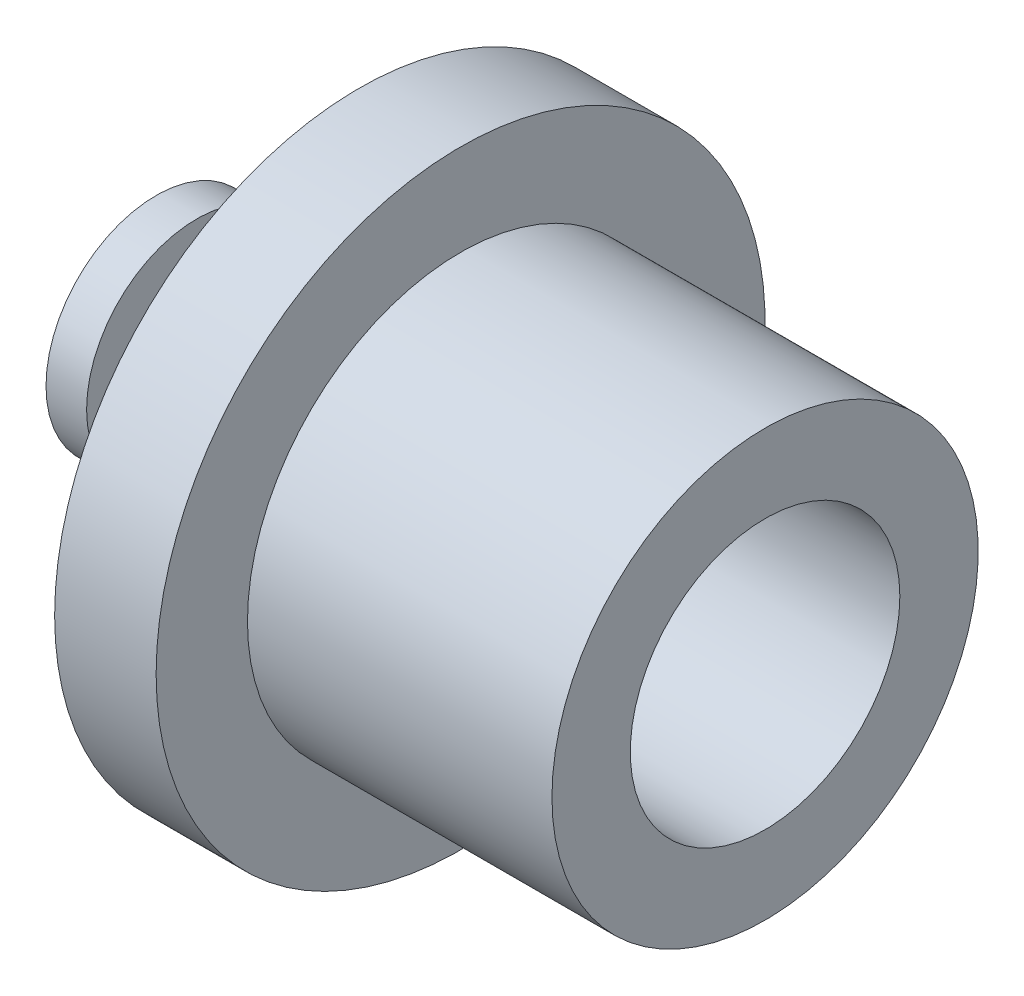
ISO-10303-21;
HEADER;
FILE_DESCRIPTION(('STEP AP214'),'2;1');
FILE_NAME('part.step','',(''),(''),'','','');
FILE_SCHEMA(('AUTOMOTIVE_DESIGN { 1 0 10303 214 1 1 1 1 }'));
ENDSEC;
DATA;
#1=APPLICATION_CONTEXT('core data for automotive mechanical design processes');
#2=APPLICATION_PROTOCOL_DEFINITION('international standard','automotive_design',2000,#1);
#3=PRODUCT_CONTEXT('',#1,'mechanical');
#4=PRODUCT('Part','Part','',(#3));
#5=PRODUCT_RELATED_PRODUCT_CATEGORY('part','',(#4));
#6=PRODUCT_DEFINITION_FORMATION('','',#4);
#7=PRODUCT_DEFINITION_CONTEXT('part definition',#1,'design');
#8=PRODUCT_DEFINITION('design','',#6,#7);
#9=PRODUCT_DEFINITION_SHAPE('','',#8);
#10=(LENGTH_UNIT() NAMED_UNIT(*) SI_UNIT(.MILLI.,.METRE.));
#11=(NAMED_UNIT(*) PLANE_ANGLE_UNIT() SI_UNIT($,.RADIAN.));
#12=(NAMED_UNIT(*) SI_UNIT($,.STERADIAN.) SOLID_ANGLE_UNIT());
#13=UNCERTAINTY_MEASURE_WITH_UNIT(LENGTH_MEASURE(1.E-05),#10,'distance_accuracy_value','');
#14=(GEOMETRIC_REPRESENTATION_CONTEXT(3) GLOBAL_UNCERTAINTY_ASSIGNED_CONTEXT((#13)) GLOBAL_UNIT_ASSIGNED_CONTEXT((#10,
#11,#12)) REPRESENTATION_CONTEXT('',''));
#15=CARTESIAN_POINT('',(0.,0.,0.));
#16=DIRECTION('',(0.,0.,1.));
#17=DIRECTION('',(1.,0.,0.));
#18=AXIS2_PLACEMENT_3D('',#15,#16,#17);
#19=CARTESIAN_POINT('',(1.27,3.444875,0.));
#20=DIRECTION('',(-1.,0.,0.));
#21=DIRECTION('',(0.,0.,1.));
#22=AXIS2_PLACEMENT_3D('',#19,#20,#21);
#23=PLANE('',#22);
#24=CARTESIAN_POINT('',(1.27,0.,0.));
#25=DIRECTION('',(-1.,0.,0.));
#26=DIRECTION('',(0.,0.,1.));
#27=AXIS2_PLACEMENT_3D('',#24,#25,#26);
#28=CIRCLE('',#27,3.444875);
#29=CARTESIAN_POINT('',(1.27,0.,3.444875));
#30=VERTEX_POINT('',#29);
#31=EDGE_CURVE('E10',#30,#30,#28,.T.);
#32=ORIENTED_EDGE('',*,*,#31,.F.);
#33=EDGE_LOOP('',(#32));
#34=FACE_BOUND('',#33,.T.);
#35=CARTESIAN_POINT('',(1.27,0.,0.));
#36=DIRECTION('',(-1.,0.,0.));
#37=DIRECTION('',(0.,0.,1.));
#38=AXIS2_PLACEMENT_3D('',#35,#36,#37);
#39=CIRCLE('',#38,2.073275);
#40=CARTESIAN_POINT('',(1.27,0.,2.073275));
#41=VERTEX_POINT('',#40);
#42=EDGE_CURVE('E83',#41,#41,#39,.T.);
#43=ORIENTED_EDGE('',*,*,#42,.T.);
#44=EDGE_LOOP('',(#43));
#45=FACE_BOUND('',#44,.T.);
#46=ADVANCED_FACE('F39',(#34,#45),#23,.F.);
#47=CARTESIAN_POINT('',(0.,0.,0.));
#48=DIRECTION('',(-1.,0.,0.));
#49=DIRECTION('',(0.,0.,1.));
#50=AXIS2_PLACEMENT_3D('',#47,#48,#49);
#51=CYLINDRICAL_SURFACE('',#50,3.444875);
#52=CARTESIAN_POINT('',(0.,0.,0.));
#53=DIRECTION('',(-1.,0.,0.));
#54=DIRECTION('',(0.,0.,1.));
#55=AXIS2_PLACEMENT_3D('',#52,#53,#54);
#56=CIRCLE('',#55,3.444875);
#57=CARTESIAN_POINT('',(0.,0.,3.444875));
#58=VERTEX_POINT('',#57);
#59=EDGE_CURVE('E47',#58,#58,#56,.T.);
#60=ORIENTED_EDGE('',*,*,#59,.F.);
#61=EDGE_LOOP('',(#60));
#62=FACE_BOUND('',#61,.T.);
#63=ORIENTED_EDGE('',*,*,#31,.T.);
#64=EDGE_LOOP('',(#63));
#65=FACE_BOUND('',#64,.T.);
#66=ADVANCED_FACE('F119',(#62,#65),#51,.T.);
#67=CARTESIAN_POINT('',(0.,0.,0.));
#68=DIRECTION('',(1.,0.,0.));
#69=DIRECTION('',(0.,0.,-1.));
#70=AXIS2_PLACEMENT_3D('',#67,#68,#69);
#71=PLANE('',#70);
#72=CARTESIAN_POINT('',(0.,0.,0.));
#73=DIRECTION('',(-1.,0.,0.));
#74=DIRECTION('',(0.,0.,1.));
#75=AXIS2_PLACEMENT_3D('',#72,#73,#74);
#76=CIRCLE('',#75,1.190625);
#77=CARTESIAN_POINT('',(0.,0.,1.190625));
#78=VERTEX_POINT('',#77);
#79=EDGE_CURVE('E95',#78,#78,#76,.T.);
#80=ORIENTED_EDGE('',*,*,#79,.F.);
#81=EDGE_LOOP('',(#80));
#82=FACE_BOUND('',#81,.T.);
#83=ORIENTED_EDGE('',*,*,#59,.T.);
#84=EDGE_LOOP('',(#83));
#85=FACE_BOUND('',#84,.T.);
#86=ADVANCED_FACE('F124',(#82,#85),#71,.F.);
#87=CARTESIAN_POINT('',(19.05,6.6675,0.));
#88=DIRECTION('',(-1.,0.,0.));
#89=DIRECTION('',(0.,0.,1.));
#90=AXIS2_PLACEMENT_3D('',#87,#88,#89);
#91=PLANE('',#90);
#92=CARTESIAN_POINT('',(19.05,0.,0.));
#93=DIRECTION('',(1.,0.,0.));
#94=DIRECTION('',(0.,0.,-1.));
#95=AXIS2_PLACEMENT_3D('',#92,#93,#94);
#96=CIRCLE('',#95,4.21639999999999);
#97=CARTESIAN_POINT('',(19.05,0.,-4.21639999999999));
#98=VERTEX_POINT('',#97);
#99=EDGE_CURVE('E91',#98,#98,#96,.T.);
#100=ORIENTED_EDGE('',*,*,#99,.F.);
#101=EDGE_LOOP('',(#100));
#102=FACE_BOUND('',#101,.T.);
#103=CARTESIAN_POINT('',(19.05,0.,0.));
#104=DIRECTION('',(-1.,0.,0.));
#105=DIRECTION('',(0.,0.,1.));
#106=AXIS2_PLACEMENT_3D('',#103,#104,#105);
#107=CIRCLE('',#106,6.6675);
#108=CARTESIAN_POINT('',(19.05,0.,6.6675));
#109=VERTEX_POINT('',#108);
#110=EDGE_CURVE('E53',#109,#109,#107,.T.);
#111=ORIENTED_EDGE('',*,*,#110,.F.);
#112=EDGE_LOOP('',(#111));
#113=FACE_BOUND('',#112,.T.);
#114=ADVANCED_FACE('F168',(#102,#113),#91,.F.);
#115=CARTESIAN_POINT('',(0.,0.,0.));
#116=DIRECTION('',(-1.,0.,0.));
#117=DIRECTION('',(0.,0.,1.));
#118=AXIS2_PLACEMENT_3D('',#115,#116,#117);
#119=CYLINDRICAL_SURFACE('',#118,6.6675);
#120=CARTESIAN_POINT('',(9.525,0.,0.));
#121=DIRECTION('',(-1.,0.,0.));
#122=DIRECTION('',(0.,0.,1.));
#123=AXIS2_PLACEMENT_3D('',#120,#121,#122);
#124=CIRCLE('',#123,6.6675);
#125=CARTESIAN_POINT('',(9.525,0.,6.6675));
#126=VERTEX_POINT('',#125);
#127=EDGE_CURVE('E59',#126,#126,#124,.T.);
#128=ORIENTED_EDGE('',*,*,#127,.F.);
#129=EDGE_LOOP('',(#128));
#130=FACE_BOUND('',#129,.T.);
#131=ORIENTED_EDGE('',*,*,#110,.T.);
#132=EDGE_LOOP('',(#131));
#133=FACE_BOUND('',#132,.T.);
#134=ADVANCED_FACE('F162',(#130,#133),#119,.T.);
#135=CARTESIAN_POINT('',(9.525,9.525,0.));
#136=DIRECTION('',(-1.,0.,0.));
#137=DIRECTION('',(0.,0.,1.));
#138=AXIS2_PLACEMENT_3D('',#135,#136,#137);
#139=PLANE('',#138);
#140=CARTESIAN_POINT('',(9.525,0.,0.));
#141=DIRECTION('',(-1.,0.,0.));
#142=DIRECTION('',(0.,0.,1.));
#143=AXIS2_PLACEMENT_3D('',#140,#141,#142);
#144=CIRCLE('',#143,9.525);
#145=CARTESIAN_POINT('',(9.525,0.,9.525));
#146=VERTEX_POINT('',#145);
#147=EDGE_CURVE('E63',#146,#146,#144,.T.);
#148=ORIENTED_EDGE('',*,*,#147,.F.);
#149=EDGE_LOOP('',(#148));
#150=FACE_BOUND('',#149,.T.);
#151=ORIENTED_EDGE('',*,*,#127,.T.);
#152=EDGE_LOOP('',(#151));
#153=FACE_BOUND('',#152,.T.);
#154=ADVANCED_FACE('F156',(#150,#153),#139,.F.);
#155=CARTESIAN_POINT('',(0.,0.,0.));
#156=DIRECTION('',(-1.,0.,0.));
#157=DIRECTION('',(0.,0.,1.));
#158=AXIS2_PLACEMENT_3D('',#155,#156,#157);
#159=CYLINDRICAL_SURFACE('',#158,9.525);
#160=CARTESIAN_POINT('',(6.35,0.,0.));
#161=DIRECTION('',(-1.,0.,0.));
#162=DIRECTION('',(0.,0.,1.));
#163=AXIS2_PLACEMENT_3D('',#160,#161,#162);
#164=CIRCLE('',#163,9.525);
#165=CARTESIAN_POINT('',(6.35,0.,9.525));
#166=VERTEX_POINT('',#165);
#167=EDGE_CURVE('E67',#166,#166,#164,.T.);
#168=ORIENTED_EDGE('',*,*,#167,.F.);
#169=EDGE_LOOP('',(#168));
#170=FACE_BOUND('',#169,.T.);
#171=ORIENTED_EDGE('',*,*,#147,.T.);
#172=EDGE_LOOP('',(#171));
#173=FACE_BOUND('',#172,.T.);
#174=ADVANCED_FACE('F150',(#170,#173),#159,.T.);
#175=CARTESIAN_POINT('',(6.35,3.444875,0.));
#176=DIRECTION('',(1.,0.,0.));
#177=DIRECTION('',(0.,0.,-1.));
#178=AXIS2_PLACEMENT_3D('',#175,#176,#177);
#179=PLANE('',#178);
#180=CARTESIAN_POINT('',(6.35,0.,0.));
#181=DIRECTION('',(-1.,0.,0.));
#182=DIRECTION('',(0.,0.,1.));
#183=AXIS2_PLACEMENT_3D('',#180,#181,#182);
#184=CIRCLE('',#183,3.444875);
#185=CARTESIAN_POINT('',(6.35,0.,3.444875));
#186=VERTEX_POINT('',#185);
#187=EDGE_CURVE('E71',#186,#186,#184,.T.);
#188=ORIENTED_EDGE('',*,*,#187,.F.);
#189=EDGE_LOOP('',(#188));
#190=FACE_BOUND('',#189,.T.);
#191=ORIENTED_EDGE('',*,*,#167,.T.);
#192=EDGE_LOOP('',(#191));
#193=FACE_BOUND('',#192,.T.);
#194=ADVANCED_FACE('F144',(#190,#193),#179,.F.);
#195=CARTESIAN_POINT('',(0.,0.,0.));
#196=DIRECTION('',(-1.,0.,0.));
#197=DIRECTION('',(0.,0.,1.));
#198=AXIS2_PLACEMENT_3D('',#195,#196,#197);
#199=CYLINDRICAL_SURFACE('',#198,3.444875);
#200=CARTESIAN_POINT('',(3.81,0.,0.));
#201=DIRECTION('',(-1.,0.,0.));
#202=DIRECTION('',(0.,0.,1.));
#203=AXIS2_PLACEMENT_3D('',#200,#201,#202);
#204=CIRCLE('',#203,3.444875);
#205=CARTESIAN_POINT('',(3.81,0.,3.444875));
#206=VERTEX_POINT('',#205);
#207=EDGE_CURVE('E75',#206,#206,#204,.T.);
#208=ORIENTED_EDGE('',*,*,#207,.F.);
#209=EDGE_LOOP('',(#208));
#210=FACE_BOUND('',#209,.T.);
#211=ORIENTED_EDGE('',*,*,#187,.T.);
#212=EDGE_LOOP('',(#211));
#213=FACE_BOUND('',#212,.T.);
#214=ADVANCED_FACE('F138',(#210,#213),#199,.T.);
#215=CARTESIAN_POINT('',(3.81,3.444875,0.));
#216=DIRECTION('',(1.,0.,0.));
#217=DIRECTION('',(0.,0.,-1.));
#218=AXIS2_PLACEMENT_3D('',#215,#216,#217);
#219=PLANE('',#218);
#220=CARTESIAN_POINT('',(3.81,0.,0.));
#221=DIRECTION('',(-1.,0.,0.));
#222=DIRECTION('',(0.,0.,1.));
#223=AXIS2_PLACEMENT_3D('',#220,#221,#222);
#224=CIRCLE('',#223,2.073275);
#225=CARTESIAN_POINT('',(3.81,0.,2.073275));
#226=VERTEX_POINT('',#225);
#227=EDGE_CURVE('E79',#226,#226,#224,.T.);
#228=ORIENTED_EDGE('',*,*,#227,.F.);
#229=EDGE_LOOP('',(#228));
#230=FACE_BOUND('',#229,.T.);
#231=ORIENTED_EDGE('',*,*,#207,.T.);
#232=EDGE_LOOP('',(#231));
#233=FACE_BOUND('',#232,.T.);
#234=ADVANCED_FACE('F132',(#230,#233),#219,.F.);
#235=CARTESIAN_POINT('',(0.,0.,0.));
#236=DIRECTION('',(-1.,0.,0.));
#237=DIRECTION('',(0.,0.,1.));
#238=AXIS2_PLACEMENT_3D('',#235,#236,#237);
#239=CYLINDRICAL_SURFACE('',#238,2.073275);
#240=ORIENTED_EDGE('',*,*,#42,.F.);
#241=EDGE_LOOP('',(#240));
#242=FACE_BOUND('',#241,.T.);
#243=ORIENTED_EDGE('',*,*,#227,.T.);
#244=EDGE_LOOP('',(#243));
#245=FACE_BOUND('',#244,.T.);
#246=ADVANCED_FACE('F129',(#242,#245),#239,.T.);
#247=CARTESIAN_POINT('',(9.525,0.,0.));
#248=DIRECTION('',(1.,0.,0.));
#249=DIRECTION('',(0.,0.,-1.));
#250=AXIS2_PLACEMENT_3D('',#247,#248,#249);
#251=CONICAL_SURFACE('',#250,4.2164,1.02974425867665);
#252=CARTESIAN_POINT('',(7.70693096046188,0.,0.));
#253=DIRECTION('',(1.,0.,0.));
#254=DIRECTION('',(0.,0.,-1.));
#255=AXIS2_PLACEMENT_3D('',#252,#253,#254);
#256=CIRCLE('',#255,1.190625);
#257=CARTESIAN_POINT('',(7.70693096046188,0.,-1.190625));
#258=VERTEX_POINT('',#257);
#259=EDGE_CURVE('E42',#258,#258,#256,.F.);
#260=CARTESIAN_POINT('',(9.525,0.,0.));
#261=DIRECTION('',(1.,0.,0.));
#262=DIRECTION('',(0.,0.,-1.));
#263=AXIS2_PLACEMENT_3D('',#260,#261,#262);
#264=CIRCLE('',#263,4.2164);
#265=CARTESIAN_POINT('',(9.525,0.,-4.21639999999999));
#266=VERTEX_POINT('',#265);
#267=EDGE_CURVE('E87',#266,#266,#264,.T.);
#268=CARTESIAN_POINT('',(7.70693096046188,0.,-1.190625));
#269=CARTESIAN_POINT('',(7.72586917962373,0.,-1.22214348958333));
#270=CARTESIAN_POINT('',(7.74480739878559,0.,-1.25366197916666));
#271=CARTESIAN_POINT('',(7.7826838371093,0.,-1.31669895833333));
#272=CARTESIAN_POINT('',(7.80162205627116,0.,-1.34821744791666));
#273=CARTESIAN_POINT('',(7.83949849459487,0.,-1.41125442708333));
#274=CARTESIAN_POINT('',(7.85843671375672,0.,-1.44277291666666));
#275=CARTESIAN_POINT('',(7.89631315208043,0.,-1.50580989583333));
#276=CARTESIAN_POINT('',(7.91525137124229,0.,-1.53732838541666));
#277=CARTESIAN_POINT('',(7.953127809566,0.,-1.60036536458333));
#278=CARTESIAN_POINT('',(7.97206602872785,0.,-1.63188385416666));
#279=CARTESIAN_POINT('',(8.00994246705156,0.,-1.69492083333333));
#280=CARTESIAN_POINT('',(8.02888068621342,0.,-1.72643932291666));
#281=CARTESIAN_POINT('',(8.06675712453713,0.,-1.78947630208333));
#282=CARTESIAN_POINT('',(8.08569534369899,0.,-1.82099479166666));
#283=CARTESIAN_POINT('',(8.1235717820227,0.,-1.88403177083333));
#284=CARTESIAN_POINT('',(8.14251000118455,0.,-1.91555026041666));
#285=CARTESIAN_POINT('',(8.18038643950826,0.,-1.97858723958333));
#286=CARTESIAN_POINT('',(8.19932465867012,0.,-2.01010572916666));
#287=CARTESIAN_POINT('',(8.23720109699383,0.,-2.07314270833333));
#288=CARTESIAN_POINT('',(8.25613931615569,0.,-2.10466119791666));
#289=CARTESIAN_POINT('',(8.2940157544794,0.,-2.16769817708333));
#290=CARTESIAN_POINT('',(8.31295397364125,0.,-2.19921666666666));
#291=CARTESIAN_POINT('',(8.35083041196496,0.,-2.26225364583333));
#292=CARTESIAN_POINT('',(8.36976863112682,0.,-2.29377213541666));
#293=CARTESIAN_POINT('',(8.40764506945053,0.,-2.35680911458333));
#294=CARTESIAN_POINT('',(8.42658328861238,0.,-2.38832760416666));
#295=CARTESIAN_POINT('',(8.4644597269361,0.,-2.45136458333333));
#296=CARTESIAN_POINT('',(8.48339794609795,0.,-2.48288307291666));
#297=CARTESIAN_POINT('',(8.52127438442166,0.,-2.54592005208333));
#298=CARTESIAN_POINT('',(8.54021260358352,0.,-2.57743854166666));
#299=CARTESIAN_POINT('',(8.57808904190723,0.,-2.64047552083333));
#300=CARTESIAN_POINT('',(8.59702726106908,0.,-2.67199401041666));
#301=CARTESIAN_POINT('',(8.63490369939279,0.,-2.73503098958333));
#302=CARTESIAN_POINT('',(8.65384191855465,0.,-2.76654947916666));
#303=CARTESIAN_POINT('',(8.69171835687836,0.,-2.82958645833333));
#304=CARTESIAN_POINT('',(8.71065657604022,0.,-2.86110494791666));
#305=CARTESIAN_POINT('',(8.74853301436393,0.,-2.92414192708333));
#306=CARTESIAN_POINT('',(8.76747123352578,0.,-2.95566041666666));
#307=CARTESIAN_POINT('',(8.80534767184949,0.,-3.01869739583333));
#308=CARTESIAN_POINT('',(8.82428589101135,0.,-3.05021588541666));
#309=CARTESIAN_POINT('',(8.86216232933506,0.,-3.11325286458333));
#310=CARTESIAN_POINT('',(8.88110054849691,0.,-3.14477135416666));
#311=CARTESIAN_POINT('',(8.91897698682062,0.,-3.20780833333333));
#312=CARTESIAN_POINT('',(8.93791520598248,0.,-3.23932682291666));
#313=CARTESIAN_POINT('',(8.97579164430619,0.,-3.30236380208333));
#314=CARTESIAN_POINT('',(8.99472986346805,0.,-3.33388229166666));
#315=CARTESIAN_POINT('',(9.03260630179176,0.,-3.39691927083333));
#316=CARTESIAN_POINT('',(9.05154452095361,0.,-3.42843776041666));
#317=CARTESIAN_POINT('',(9.08942095927732,0.,-3.49147473958333));
#318=CARTESIAN_POINT('',(9.10835917843918,0.,-3.52299322916666));
#319=CARTESIAN_POINT('',(9.14623561676289,0.,-3.58603020833333));
#320=CARTESIAN_POINT('',(9.16517383592475,0.,-3.61754869791666));
#321=CARTESIAN_POINT('',(9.20305027424846,0.,-3.68058567708333));
#322=CARTESIAN_POINT('',(9.22198849341031,0.,-3.71210416666666));
#323=CARTESIAN_POINT('',(9.25986493173402,0.,-3.77514114583333));
#324=CARTESIAN_POINT('',(9.27880315089588,0.,-3.80665963541666));
#325=CARTESIAN_POINT('',(9.31667958921959,0.,-3.86969661458333));
#326=CARTESIAN_POINT('',(9.33561780838144,0.,-3.90121510416666));
#327=CARTESIAN_POINT('',(9.37349424670515,0.,-3.96425208333333));
#328=CARTESIAN_POINT('',(9.39243246586701,0.,-3.99577057291666));
#329=CARTESIAN_POINT('',(9.43030890419072,0.,-4.05880755208333));
#330=CARTESIAN_POINT('',(9.44924712335258,0.,-4.09032604166666));
#331=CARTESIAN_POINT('',(9.48712356167629,0.,-4.15336302083333));
#332=CARTESIAN_POINT('',(9.50606178083814,0.,-4.18488151041666));
#333=CARTESIAN_POINT('',(9.525,0.,-4.21639999999999));
#334=B_SPLINE_CURVE_WITH_KNOTS('',3,(#268,#269,#270,#271,#272,#273,#274,#275,#276,#277,#278,
#279,#280,#281,#282,#283,#284,#285,#286,#287,#288,#289,#290,#291,#292,#293,#294,#295,#296,#297,
#298,#299,#300,#301,#302,#303,#304,#305,#306,#307,#308,#309,#310,#311,#312,#313,#314,#315,#316,
#317,#318,#319,#320,#321,#322,#323,#324,#325,#326,#327,#328,#329,#330,#331,#332,#333),
.UNSPECIFIED.,.F.,.F.,(4,2,2,2,2,2,2,2,2,2,2,2,2,2,2,2,2,2,2,2,2,2,2,2,2,2,2,2,2,2,2,2,4),(0.,
0.110311567733101,0.220623135466201,0.330934703199302,0.441246270932402,0.551557838665503,
0.661869406398604,0.772180974131704,0.882492541864804,0.992804109597905,1.10311567733101,
1.21342724506411,1.32373881279721,1.43405038053031,1.54436194826341,1.65467351599651,
1.76498508372961,1.87529665146271,1.98560821919581,2.09591978692891,2.20623135466201,
2.31654292239511,2.42685449012821,2.53716605786131,2.64747762559441,2.75778919332751,
2.86810076106062,2.97841232879371,3.08872389652682,3.19903546425992,3.30934703199302,
3.41965859972612,3.52997016745922),.UNSPECIFIED.);
#335=EDGE_CURVE('BSEAM106',#258,#266,#334,.T.);
#336=ORIENTED_EDGE('',*,*,#259,.T.);
#337=ORIENTED_EDGE('',*,*,#267,.T.);
#338=ORIENTED_EDGE('',*,*,#335,.T.);
#339=ORIENTED_EDGE('',*,*,#335,.F.);
#340=EDGE_LOOP('',(#336,#338,#337,#339));
#341=FACE_BOUND('',#340,.T.);
#342=ADVANCED_FACE('F106',(#341),#251,.F.);
#343=CARTESIAN_POINT('',(19.05,0.,0.));
#344=DIRECTION('',(1.,0.,0.));
#345=DIRECTION('',(0.,0.,-1.));
#346=AXIS2_PLACEMENT_3D('',#343,#344,#345);
#347=CYLINDRICAL_SURFACE('',#346,4.21639999999999);
#348=ORIENTED_EDGE('',*,*,#267,.F.);
#349=EDGE_LOOP('',(#348));
#350=FACE_BOUND('',#349,.T.);
#351=ORIENTED_EDGE('',*,*,#99,.T.);
#352=EDGE_LOOP('',(#351));
#353=FACE_BOUND('',#352,.T.);
#354=ADVANCED_FACE('F111',(#350,#353),#347,.F.);
#355=CARTESIAN_POINT('',(0.,0.,0.));
#356=DIRECTION('',(-1.,0.,0.));
#357=DIRECTION('',(0.,0.,1.));
#358=AXIS2_PLACEMENT_3D('',#355,#356,#357);
#359=CYLINDRICAL_SURFACE('',#358,1.190625);
#360=ORIENTED_EDGE('',*,*,#79,.T.);
#361=EDGE_LOOP('',(#360));
#362=FACE_BOUND('',#361,.T.);
#363=ORIENTED_EDGE('',*,*,#259,.F.);
#364=EDGE_LOOP('',(#363));
#365=FACE_BOUND('',#364,.T.);
#366=ADVANCED_FACE('F109',(#362,#365),#359,.F.);
#367=CLOSED_SHELL('',(#46,#66,#86,#114,#134,#154,#174,#194,#214,#234,#246,#342,#354,#366));
#368=MANIFOLD_SOLID_BREP('B2',#367);
#369=ADVANCED_BREP_SHAPE_REPRESENTATION('',(#18,#368),#14);
#370=SHAPE_DEFINITION_REPRESENTATION(#9,#369);
ENDSEC;
END-ISO-10303-21;
